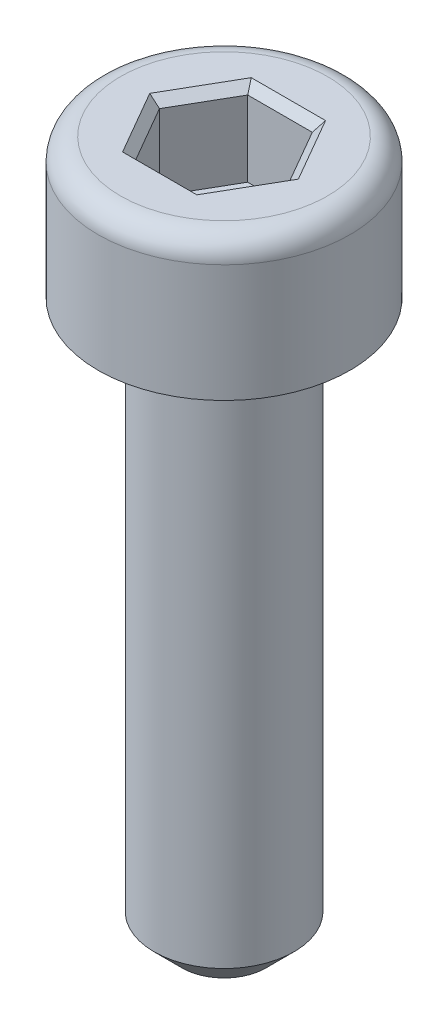
ISO-10303-21;
HEADER;
FILE_DESCRIPTION(('STEP AP214'),'2;1');
FILE_NAME('part.step','',(''),(''),'','','');
FILE_SCHEMA(('AUTOMOTIVE_DESIGN { 1 0 10303 214 1 1 1 1 }'));
ENDSEC;
DATA;
#1=APPLICATION_CONTEXT('core data for automotive mechanical design processes');
#2=APPLICATION_PROTOCOL_DEFINITION('international standard','automotive_design',2000,#1);
#3=PRODUCT_CONTEXT('',#1,'mechanical');
#4=PRODUCT('Part','Part','',(#3));
#5=PRODUCT_RELATED_PRODUCT_CATEGORY('part','',(#4));
#6=PRODUCT_DEFINITION_FORMATION('','',#4);
#7=PRODUCT_DEFINITION_CONTEXT('part definition',#1,'design');
#8=PRODUCT_DEFINITION('design','',#6,#7);
#9=PRODUCT_DEFINITION_SHAPE('','',#8);
#10=(LENGTH_UNIT() NAMED_UNIT(*) SI_UNIT(.MILLI.,.METRE.));
#11=(NAMED_UNIT(*) PLANE_ANGLE_UNIT() SI_UNIT($,.RADIAN.));
#12=(NAMED_UNIT(*) SI_UNIT($,.STERADIAN.) SOLID_ANGLE_UNIT());
#13=UNCERTAINTY_MEASURE_WITH_UNIT(LENGTH_MEASURE(1.E-05),#10,'distance_accuracy_value','');
#14=(GEOMETRIC_REPRESENTATION_CONTEXT(3) GLOBAL_UNCERTAINTY_ASSIGNED_CONTEXT((#13)) GLOBAL_UNIT_ASSIGNED_CONTEXT((#10,
#11,#12)) REPRESENTATION_CONTEXT('',''));
#15=CARTESIAN_POINT('',(0.,0.,0.));
#16=DIRECTION('',(0.,0.,1.));
#17=DIRECTION('',(1.,0.,0.));
#18=AXIS2_PLACEMENT_3D('',#15,#16,#17);
#19=CARTESIAN_POINT('',(0.,2.5,0.));
#20=DIRECTION('',(0.,-1.,0.));
#21=DIRECTION('',(0.,0.,-1.));
#22=AXIS2_PLACEMENT_3D('',#19,#20,#21);
#23=PLANE('',#22);
#24=DIRECTION('',(-0.5,0.,-0.866025403784439));
#25=VECTOR('',#24,1.);
#26=CARTESIAN_POINT('',(-0.995929214352107,2.5,0.575000000000003));
#27=LINE('',#26,#25);
#28=CARTESIAN_POINT('',(-0.663952809568066,2.5,1.15000000000001));
#29=VERTEX_POINT('',#28);
#30=CARTESIAN_POINT('',(-1.32790561913614,2.5,0.));
#31=VERTEX_POINT('',#30);
#32=EDGE_CURVE('E179',#29,#31,#27,.T.);
#33=ORIENTED_EDGE('',*,*,#32,.T.);
#34=DIRECTION('',(0.5,0.,-0.866025403784439));
#35=VECTOR('',#34,1.);
#36=CARTESIAN_POINT('',(-0.995929214352096,2.5,-0.574999999999997));
#37=LINE('',#36,#35);
#38=CARTESIAN_POINT('',(-0.663952809568066,2.5,-1.14999999999999));
#39=VERTEX_POINT('',#38);
#40=EDGE_CURVE('E181',#31,#39,#37,.T.);
#41=ORIENTED_EDGE('',*,*,#40,.T.);
#42=DIRECTION('',(1.,0.,0.));
#43=VECTOR('',#42,1.);
#44=CARTESIAN_POINT('',(0.,2.5,-1.14999999999999));
#45=LINE('',#44,#43);
#46=CARTESIAN_POINT('',(0.663952809568074,2.5,-1.14999999999999));
#47=VERTEX_POINT('',#46);
#48=EDGE_CURVE('E171',#39,#47,#45,.T.);
#49=ORIENTED_EDGE('',*,*,#48,.T.);
#50=DIRECTION('',(0.5,0.,0.866025403784439));
#51=VECTOR('',#50,1.);
#52=CARTESIAN_POINT('',(0.995929214352104,2.5,-0.574999999999999));
#53=LINE('',#52,#51);
#54=CARTESIAN_POINT('',(1.32790561913614,2.5,0.));
#55=VERTEX_POINT('',#54);
#56=EDGE_CURVE('E173',#47,#55,#53,.T.);
#57=ORIENTED_EDGE('',*,*,#56,.T.);
#58=DIRECTION('',(-0.5,0.,0.866025403784439));
#59=VECTOR('',#58,1.);
#60=CARTESIAN_POINT('',(0.995929214352114,2.5,0.575000000000004));
#61=LINE('',#60,#59);
#62=CARTESIAN_POINT('',(0.663952809568074,2.5,1.15000000000001));
#63=VERTEX_POINT('',#62);
#64=EDGE_CURVE('E175',#55,#63,#61,.T.);
#65=ORIENTED_EDGE('',*,*,#64,.T.);
#66=DIRECTION('',(-1.,0.,0.));
#67=VECTOR('',#66,1.);
#68=CARTESIAN_POINT('',(0.,2.5,1.15000000000001));
#69=LINE('',#68,#67);
#70=EDGE_CURVE('E177',#63,#29,#69,.T.);
#71=ORIENTED_EDGE('',*,*,#70,.T.);
#72=EDGE_LOOP('',(#33,#41,#49,#57,#65,#71));
#73=FACE_BOUND('',#72,.T.);
#74=CARTESIAN_POINT('',(0.,2.5,0.));
#75=DIRECTION('',(0.,1.,0.));
#76=DIRECTION('',(0.,0.,1.));
#77=AXIS2_PLACEMENT_3D('',#74,#75,#76);
#78=CIRCLE('',#77,1.85);
#79=CARTESIAN_POINT('',(0.,2.5,1.85));
#80=VERTEX_POINT('',#79);
#81=EDGE_CURVE('E167',#80,#80,#78,.T.);
#82=ORIENTED_EDGE('',*,*,#81,.T.);
#83=EDGE_LOOP('',(#82));
#84=FACE_BOUND('',#83,.T.);
#85=ADVANCED_FACE('F34',(#73,#84),#23,.F.);
#86=CARTESIAN_POINT('',(0.,2.1,0.));
#87=DIRECTION('',(0.,1.,0.));
#88=DIRECTION('',(0.,0.,1.));
#89=AXIS2_PLACEMENT_3D('',#86,#87,#88);
#90=TOROIDAL_SURFACE('',#89,1.85,0.4);
#91=ORIENTED_EDGE('',*,*,#81,.F.);
#92=EDGE_LOOP('',(#91));
#93=FACE_BOUND('',#92,.T.);
#94=CARTESIAN_POINT('',(0.,2.1,0.));
#95=DIRECTION('',(0.,1.,0.));
#96=DIRECTION('',(0.,0.,1.));
#97=AXIS2_PLACEMENT_3D('',#94,#95,#96);
#98=CIRCLE('',#97,2.25);
#99=CARTESIAN_POINT('',(0.,2.1,2.25));
#100=VERTEX_POINT('',#99);
#101=EDGE_CURVE('E164',#100,#100,#98,.T.);
#102=ORIENTED_EDGE('',*,*,#101,.T.);
#103=EDGE_LOOP('',(#102));
#104=FACE_BOUND('',#103,.T.);
#105=ADVANCED_FACE('F235',(#93,#104),#90,.T.);
#106=CARTESIAN_POINT('',(0.,6.97297297297297,0.));
#107=DIRECTION('',(0.,1.,0.));
#108=DIRECTION('',(0.,0.,1.));
#109=AXIS2_PLACEMENT_3D('',#106,#107,#108);
#110=CYLINDRICAL_SURFACE('',#109,2.25);
#111=ORIENTED_EDGE('',*,*,#101,.F.);
#112=EDGE_LOOP('',(#111));
#113=FACE_BOUND('',#112,.T.);
#114=CARTESIAN_POINT('',(0.,0.,0.));
#115=DIRECTION('',(0.,1.,0.));
#116=DIRECTION('',(0.,0.,1.));
#117=AXIS2_PLACEMENT_3D('',#114,#115,#116);
#118=CIRCLE('',#117,2.25);
#119=CARTESIAN_POINT('',(0.,0.,2.25));
#120=VERTEX_POINT('',#119);
#121=EDGE_CURVE('E161',#120,#120,#118,.T.);
#122=ORIENTED_EDGE('',*,*,#121,.T.);
#123=EDGE_LOOP('',(#122));
#124=FACE_BOUND('',#123,.T.);
#125=ADVANCED_FACE('F241',(#113,#124),#110,.T.);
#126=CARTESIAN_POINT('',(2.25,0.,0.));
#127=DIRECTION('',(0.,1.,0.));
#128=DIRECTION('',(0.,0.,1.));
#129=AXIS2_PLACEMENT_3D('',#126,#127,#128);
#130=PLANE('',#129);
#131=ORIENTED_EDGE('',*,*,#121,.F.);
#132=EDGE_LOOP('',(#131));
#133=FACE_BOUND('',#132,.T.);
#134=CARTESIAN_POINT('',(0.,0.,0.));
#135=DIRECTION('',(0.,1.,0.));
#136=DIRECTION('',(0.,0.,1.));
#137=AXIS2_PLACEMENT_3D('',#134,#135,#136);
#138=CIRCLE('',#137,1.25);
#139=CARTESIAN_POINT('',(0.,0.,1.25));
#140=VERTEX_POINT('',#139);
#141=EDGE_CURVE('E158',#140,#140,#138,.T.);
#142=ORIENTED_EDGE('',*,*,#141,.T.);
#143=EDGE_LOOP('',(#142));
#144=FACE_BOUND('',#143,.T.);
#145=ADVANCED_FACE('F371',(#133,#144),#130,.F.);
#146=CARTESIAN_POINT('',(0.,6.97297297297297,0.));
#147=DIRECTION('',(0.,1.,0.));
#148=DIRECTION('',(0.,0.,1.));
#149=AXIS2_PLACEMENT_3D('',#146,#147,#148);
#150=CYLINDRICAL_SURFACE('',#149,1.25);
#151=ORIENTED_EDGE('',*,*,#141,.F.);
#152=EDGE_LOOP('',(#151));
#153=FACE_BOUND('',#152,.T.);
#154=CARTESIAN_POINT('',(0.,-9.5,0.));
#155=DIRECTION('',(0.,1.,0.));
#156=DIRECTION('',(0.,0.,1.));
#157=AXIS2_PLACEMENT_3D('',#154,#155,#156);
#158=CIRCLE('',#157,1.25);
#159=CARTESIAN_POINT('',(0.,-9.5,1.25));
#160=VERTEX_POINT('',#159);
#161=EDGE_CURVE('E155',#160,#160,#158,.T.);
#162=ORIENTED_EDGE('',*,*,#161,.T.);
#163=EDGE_LOOP('',(#162));
#164=FACE_BOUND('',#163,.T.);
#165=ADVANCED_FACE('F362',(#153,#164),#150,.T.);
#166=CARTESIAN_POINT('',(0.,-10.,0.));
#167=DIRECTION('',(0.,1.,0.));
#168=DIRECTION('',(0.,0.,1.));
#169=AXIS2_PLACEMENT_3D('',#166,#167,#168);
#170=CONICAL_SURFACE('',#169,0.750000000000002,0.785398163397448);
#171=ORIENTED_EDGE('',*,*,#161,.F.);
#172=EDGE_LOOP('',(#171));
#173=FACE_BOUND('',#172,.T.);
#174=CARTESIAN_POINT('',(0.,-10.,0.));
#175=DIRECTION('',(0.,1.,0.));
#176=DIRECTION('',(0.,0.,1.));
#177=AXIS2_PLACEMENT_3D('',#174,#175,#176);
#178=CIRCLE('',#177,0.750000000000002);
#179=CARTESIAN_POINT('',(0.,-10.,0.750000000000002));
#180=VERTEX_POINT('',#179);
#181=EDGE_CURVE('E145',#180,#180,#178,.T.);
#182=ORIENTED_EDGE('',*,*,#181,.T.);
#183=EDGE_LOOP('',(#182));
#184=FACE_BOUND('',#183,.T.);
#185=ADVANCED_FACE('F357',(#173,#184),#170,.T.);
#186=CARTESIAN_POINT('',(0.750000000000002,-10.,0.));
#187=DIRECTION('',(0.,1.,0.));
#188=DIRECTION('',(0.,0.,1.));
#189=AXIS2_PLACEMENT_3D('',#186,#187,#188);
#190=PLANE('',#189);
#191=ORIENTED_EDGE('',*,*,#181,.F.);
#192=EDGE_LOOP('',(#191));
#193=FACE_BOUND('',#192,.T.);
#194=ADVANCED_FACE('F332',(#193),#190,.F.);
#195=CARTESIAN_POINT('',(-0.577350269189622,1.,-0.999999999999988));
#196=DIRECTION('',(-0.866025403784439,0.,-0.5));
#197=DIRECTION('',(-0.5,0.,0.866025403784439));
#198=AXIS2_PLACEMENT_3D('',#195,#196,#197);
#199=PLANE('',#198);
#200=DIRECTION('',(0.,1.,0.));
#201=VECTOR('',#200,1.);
#202=CARTESIAN_POINT('',(-0.577350269189622,1.,-0.999999999999988));
#203=LINE('',#202,#201);
#204=CARTESIAN_POINT('',(-0.577350269189622,1.,-0.999999999999988));
#205=VERTEX_POINT('',#204);
#206=CARTESIAN_POINT('',(-0.577350269189622,2.35,-0.999999999999988));
#207=VERTEX_POINT('',#206);
#208=EDGE_CURVE('E143',#205,#207,#203,.T.);
#209=ORIENTED_EDGE('',*,*,#208,.T.);
#210=DIRECTION('',(-0.5,0.,0.866025403784439));
#211=VECTOR('',#210,1.);
#212=CARTESIAN_POINT('',(-0.577350269189622,2.35,-0.999999999999988));
#213=LINE('',#212,#211);
#214=CARTESIAN_POINT('',(-1.15470053837925,2.35,0.));
#215=VERTEX_POINT('',#214);
#216=EDGE_CURVE('E115',#207,#215,#213,.T.);
#217=ORIENTED_EDGE('',*,*,#216,.T.);
#218=DIRECTION('',(0.,1.,0.));
#219=VECTOR('',#218,1.);
#220=CARTESIAN_POINT('',(-1.15470053837925,1.,0.));
#221=LINE('',#220,#219);
#222=CARTESIAN_POINT('',(-1.15470053837925,1.,0.));
#223=VERTEX_POINT('',#222);
#224=EDGE_CURVE('E107',#223,#215,#221,.T.);
#225=ORIENTED_EDGE('',*,*,#224,.F.);
#226=DIRECTION('',(-0.5,0.,0.866025403784438));
#227=VECTOR('',#226,1.);
#228=CARTESIAN_POINT('',(-0.577350269189622,1.,-0.999999999999988));
#229=LINE('',#228,#227);
#230=EDGE_CURVE('E112',#205,#223,#229,.T.);
#231=ORIENTED_EDGE('',*,*,#230,.F.);
#232=EDGE_LOOP('',(#209,#217,#225,#231));
#233=FACE_BOUND('',#232,.T.);
#234=ADVANCED_FACE('F110',(#233),#199,.F.);
#235=CARTESIAN_POINT('',(0.57735026918963,1.,-0.999999999999989));
#236=DIRECTION('',(0.,0.,-1.));
#237=DIRECTION('',(-1.,0.,0.));
#238=AXIS2_PLACEMENT_3D('',#235,#236,#237);
#239=PLANE('',#238);
#240=DIRECTION('',(0.,1.,0.));
#241=VECTOR('',#240,1.);
#242=CARTESIAN_POINT('',(0.57735026918963,1.,-0.999999999999989));
#243=LINE('',#242,#241);
#244=CARTESIAN_POINT('',(0.57735026918963,1.,-0.999999999999989));
#245=VERTEX_POINT('',#244);
#246=CARTESIAN_POINT('',(0.57735026918963,2.35,-0.999999999999989));
#247=VERTEX_POINT('',#246);
#248=EDGE_CURVE('E146',#245,#247,#243,.T.);
#249=ORIENTED_EDGE('',*,*,#248,.T.);
#250=DIRECTION('',(-1.,0.,0.));
#251=VECTOR('',#250,1.);
#252=CARTESIAN_POINT('',(0.57735026918963,2.35,-0.999999999999989));
#253=LINE('',#252,#251);
#254=EDGE_CURVE('E11',#247,#207,#253,.T.);
#255=ORIENTED_EDGE('',*,*,#254,.T.);
#256=ORIENTED_EDGE('',*,*,#208,.F.);
#257=DIRECTION('',(-1.,0.,0.));
#258=VECTOR('',#257,1.);
#259=CARTESIAN_POINT('',(0.57735026918963,1.,-0.999999999999989));
#260=LINE('',#259,#258);
#261=EDGE_CURVE('E118',#245,#205,#260,.T.);
#262=ORIENTED_EDGE('',*,*,#261,.F.);
#263=EDGE_LOOP('',(#249,#255,#256,#262));
#264=FACE_BOUND('',#263,.T.);
#265=ADVANCED_FACE('F219',(#264),#239,.F.);
#266=CARTESIAN_POINT('',(1.15470053837926,1.,0.));
#267=DIRECTION('',(0.866025403784439,0.,-0.5));
#268=DIRECTION('',(-0.5,0.,-0.866025403784439));
#269=AXIS2_PLACEMENT_3D('',#266,#267,#268);
#270=PLANE('',#269);
#271=DIRECTION('',(0.,1.,0.));
#272=VECTOR('',#271,1.);
#273=CARTESIAN_POINT('',(1.15470053837926,1.,0.));
#274=LINE('',#273,#272);
#275=CARTESIAN_POINT('',(1.15470053837926,1.,0.));
#276=VERTEX_POINT('',#275);
#277=CARTESIAN_POINT('',(1.15470053837926,2.35,0.));
#278=VERTEX_POINT('',#277);
#279=EDGE_CURVE('E148',#276,#278,#274,.T.);
#280=ORIENTED_EDGE('',*,*,#279,.T.);
#281=DIRECTION('',(-0.5,0.,-0.866025403784439));
#282=VECTOR('',#281,1.);
#283=CARTESIAN_POINT('',(1.15470053837926,2.35,0.));
#284=LINE('',#283,#282);
#285=EDGE_CURVE('E43',#278,#247,#284,.T.);
#286=ORIENTED_EDGE('',*,*,#285,.T.);
#287=ORIENTED_EDGE('',*,*,#248,.F.);
#288=DIRECTION('',(-0.5,0.,-0.866025403784438));
#289=VECTOR('',#288,1.);
#290=CARTESIAN_POINT('',(1.15470053837926,1.,0.));
#291=LINE('',#290,#289);
#292=EDGE_CURVE('E140',#276,#245,#291,.T.);
#293=ORIENTED_EDGE('',*,*,#292,.F.);
#294=EDGE_LOOP('',(#280,#286,#287,#293));
#295=FACE_BOUND('',#294,.T.);
#296=ADVANCED_FACE('F221',(#295),#270,.F.);
#297=CARTESIAN_POINT('',(0.57735026918963,1.,1.00000000000001));
#298=DIRECTION('',(0.866025403784439,0.,0.5));
#299=DIRECTION('',(0.5,0.,-0.866025403784439));
#300=AXIS2_PLACEMENT_3D('',#297,#298,#299);
#301=PLANE('',#300);
#302=DIRECTION('',(0.,1.,0.));
#303=VECTOR('',#302,1.);
#304=CARTESIAN_POINT('',(0.57735026918963,1.,1.00000000000001));
#305=LINE('',#304,#303);
#306=CARTESIAN_POINT('',(0.57735026918963,1.,1.00000000000001));
#307=VERTEX_POINT('',#306);
#308=CARTESIAN_POINT('',(0.57735026918963,2.35,1.00000000000001));
#309=VERTEX_POINT('',#308);
#310=EDGE_CURVE('E150',#307,#309,#305,.T.);
#311=ORIENTED_EDGE('',*,*,#310,.T.);
#312=DIRECTION('',(0.5,0.,-0.866025403784439));
#313=VECTOR('',#312,1.);
#314=CARTESIAN_POINT('',(0.57735026918963,2.35,1.00000000000001));
#315=LINE('',#314,#313);
#316=EDGE_CURVE('E58',#309,#278,#315,.T.);
#317=ORIENTED_EDGE('',*,*,#316,.T.);
#318=ORIENTED_EDGE('',*,*,#279,.F.);
#319=DIRECTION('',(0.5,0.,-0.866025403784439));
#320=VECTOR('',#319,1.);
#321=CARTESIAN_POINT('',(0.57735026918963,1.,1.00000000000001));
#322=LINE('',#321,#320);
#323=EDGE_CURVE('E137',#307,#276,#322,.T.);
#324=ORIENTED_EDGE('',*,*,#323,.F.);
#325=EDGE_LOOP('',(#311,#317,#318,#324));
#326=FACE_BOUND('',#325,.T.);
#327=ADVANCED_FACE('F223',(#326),#301,.F.);
#328=CARTESIAN_POINT('',(-0.577350269189622,1.,1.00000000000001));
#329=DIRECTION('',(0.,0.,1.));
#330=DIRECTION('',(1.,0.,0.));
#331=AXIS2_PLACEMENT_3D('',#328,#329,#330);
#332=PLANE('',#331);
#333=DIRECTION('',(0.,1.,0.));
#334=VECTOR('',#333,1.);
#335=CARTESIAN_POINT('',(-0.577350269189622,1.,1.00000000000001));
#336=LINE('',#335,#334);
#337=CARTESIAN_POINT('',(-0.577350269189622,1.,1.00000000000001));
#338=VERTEX_POINT('',#337);
#339=CARTESIAN_POINT('',(-0.577350269189622,2.35,1.00000000000001));
#340=VERTEX_POINT('',#339);
#341=EDGE_CURVE('E117',#338,#340,#336,.T.);
#342=ORIENTED_EDGE('',*,*,#341,.T.);
#343=DIRECTION('',(1.,0.,0.));
#344=VECTOR('',#343,1.);
#345=CARTESIAN_POINT('',(-0.577350269189622,2.35,1.00000000000001));
#346=LINE('',#345,#344);
#347=EDGE_CURVE('E186',#340,#309,#346,.T.);
#348=ORIENTED_EDGE('',*,*,#347,.T.);
#349=ORIENTED_EDGE('',*,*,#310,.F.);
#350=DIRECTION('',(1.,0.,0.));
#351=VECTOR('',#350,1.);
#352=CARTESIAN_POINT('',(-0.577350269189622,1.,1.00000000000001));
#353=LINE('',#352,#351);
#354=EDGE_CURVE('E127',#338,#307,#353,.T.);
#355=ORIENTED_EDGE('',*,*,#354,.F.);
#356=EDGE_LOOP('',(#342,#348,#349,#355));
#357=FACE_BOUND('',#356,.T.);
#358=ADVANCED_FACE('F225',(#357),#332,.F.);
#359=CARTESIAN_POINT('',(-1.15470053837925,1.,0.));
#360=DIRECTION('',(-0.866025403784439,0.,0.5));
#361=DIRECTION('',(0.5,0.,0.866025403784439));
#362=AXIS2_PLACEMENT_3D('',#359,#360,#361);
#363=PLANE('',#362);
#364=ORIENTED_EDGE('',*,*,#224,.T.);
#365=DIRECTION('',(0.5,0.,0.866025403784439));
#366=VECTOR('',#365,1.);
#367=CARTESIAN_POINT('',(-1.15470053837925,2.35,0.));
#368=LINE('',#367,#366);
#369=EDGE_CURVE('E184',#215,#340,#368,.T.);
#370=ORIENTED_EDGE('',*,*,#369,.T.);
#371=ORIENTED_EDGE('',*,*,#341,.F.);
#372=DIRECTION('',(0.5,0.,0.866025403784439));
#373=VECTOR('',#372,1.);
#374=CARTESIAN_POINT('',(-1.15470053837925,1.,0.));
#375=LINE('',#374,#373);
#376=EDGE_CURVE('E121',#223,#338,#375,.T.);
#377=ORIENTED_EDGE('',*,*,#376,.F.);
#378=EDGE_LOOP('',(#364,#370,#371,#377));
#379=FACE_BOUND('',#378,.T.);
#380=ADVANCED_FACE('F122',(#379),#363,.F.);
#381=CARTESIAN_POINT('',(0.,1.,0.));
#382=DIRECTION('',(0.,1.,0.));
#383=DIRECTION('',(0.,0.,1.));
#384=AXIS2_PLACEMENT_3D('',#381,#382,#383);
#385=PLANE('',#384);
#386=ORIENTED_EDGE('',*,*,#230,.T.);
#387=ORIENTED_EDGE('',*,*,#376,.T.);
#388=ORIENTED_EDGE('',*,*,#354,.T.);
#389=ORIENTED_EDGE('',*,*,#323,.T.);
#390=ORIENTED_EDGE('',*,*,#292,.T.);
#391=ORIENTED_EDGE('',*,*,#261,.T.);
#392=EDGE_LOOP('',(#386,#387,#388,#389,#390,#391));
#393=FACE_BOUND('',#392,.T.);
#394=ADVANCED_FACE('F129',(#393),#385,.T.);
#395=CARTESIAN_POINT('',(0.57735026918963,2.35,1.00000000000001));
#396=DIRECTION('',(0.612372435695791,-0.707106781186552,0.353553390593271));
#397=DIRECTION('',(0.5,0.,-0.866025403784439));
#398=AXIS2_PLACEMENT_3D('',#395,#396,#397);
#399=PLANE('',#398);
#400=DIRECTION('',(0.37796447300923,0.654653670707973,0.65465367070798));
#401=VECTOR('',#400,1.);
#402=CARTESIAN_POINT('',(0.412393049421163,2.06428571428572,0.714285714285723));
#403=LINE('',#402,#401);
#404=EDGE_CURVE('E134',#63,#309,#403,.F.);
#405=ORIENTED_EDGE('',*,*,#404,.F.);
#406=ORIENTED_EDGE('',*,*,#64,.F.);
#407=DIRECTION('',(0.755928946018459,0.654653670707972,0.));
#408=VECTOR('',#407,1.);
#409=CARTESIAN_POINT('',(0.824786098842322,2.06428571428572,0.));
#410=LINE('',#409,#408);
#411=EDGE_CURVE('E38',#278,#55,#410,.T.);
#412=ORIENTED_EDGE('',*,*,#411,.F.);
#413=ORIENTED_EDGE('',*,*,#316,.F.);
#414=EDGE_LOOP('',(#405,#406,#412,#413));
#415=FACE_BOUND('',#414,.T.);
#416=ADVANCED_FACE('F36',(#415),#399,.F.);
#417=CARTESIAN_POINT('',(1.15470053837926,2.35,0.));
#418=DIRECTION('',(0.61237243569579,-0.707106781186552,-0.353553390593272));
#419=DIRECTION('',(-0.5,0.,-0.866025403784439));
#420=AXIS2_PLACEMENT_3D('',#417,#418,#419);
#421=PLANE('',#420);
#422=ORIENTED_EDGE('',*,*,#411,.T.);
#423=ORIENTED_EDGE('',*,*,#56,.F.);
#424=DIRECTION('',(0.37796447300923,0.654653670707973,-0.65465367070798));
#425=VECTOR('',#424,1.);
#426=CARTESIAN_POINT('',(0.412393049421164,2.06428571428572,-0.714285714285701));
#427=LINE('',#426,#425);
#428=EDGE_CURVE('E197',#247,#47,#427,.T.);
#429=ORIENTED_EDGE('',*,*,#428,.F.);
#430=ORIENTED_EDGE('',*,*,#285,.F.);
#431=EDGE_LOOP('',(#422,#423,#429,#430));
#432=FACE_BOUND('',#431,.T.);
#433=ADVANCED_FACE('F212',(#432),#421,.F.);
#434=CARTESIAN_POINT('',(-0.577350269189622,2.35,1.00000000000001));
#435=DIRECTION('',(0.,-0.707106781186552,0.707106781186543));
#436=DIRECTION('',(1.,0.,0.));
#437=AXIS2_PLACEMENT_3D('',#434,#435,#436);
#438=PLANE('',#437);
#439=ORIENTED_EDGE('',*,*,#404,.T.);
#440=ORIENTED_EDGE('',*,*,#347,.F.);
#441=DIRECTION('',(-0.377964473009229,0.654653670707973,0.65465367070798));
#442=VECTOR('',#441,1.);
#443=CARTESIAN_POINT('',(-0.412393049421155,2.06428571428572,0.714285714285724));
#444=LINE('',#443,#442);
#445=EDGE_CURVE('E194',#29,#340,#444,.F.);
#446=ORIENTED_EDGE('',*,*,#445,.F.);
#447=ORIENTED_EDGE('',*,*,#70,.F.);
#448=EDGE_LOOP('',(#439,#440,#446,#447));
#449=FACE_BOUND('',#448,.T.);
#450=ADVANCED_FACE('F204',(#449),#438,.F.);
#451=CARTESIAN_POINT('',(0.57735026918963,2.35,-0.999999999999989));
#452=DIRECTION('',(0.,-0.707106781186552,-0.707106781186543));
#453=DIRECTION('',(-1.,0.,0.));
#454=AXIS2_PLACEMENT_3D('',#451,#452,#453);
#455=PLANE('',#454);
#456=ORIENTED_EDGE('',*,*,#428,.T.);
#457=ORIENTED_EDGE('',*,*,#48,.F.);
#458=DIRECTION('',(0.377964473009229,-0.654653670707973,0.654653670707981));
#459=VECTOR('',#458,1.);
#460=CARTESIAN_POINT('',(-0.577350269189622,2.35,-0.999999999999988));
#461=LINE('',#460,#459);
#462=EDGE_CURVE('E192',#207,#39,#461,.F.);
#463=ORIENTED_EDGE('',*,*,#462,.F.);
#464=ORIENTED_EDGE('',*,*,#254,.F.);
#465=EDGE_LOOP('',(#456,#457,#463,#464));
#466=FACE_BOUND('',#465,.T.);
#467=ADVANCED_FACE('F217',(#466),#455,.F.);
#468=CARTESIAN_POINT('',(-1.15470053837925,2.35,0.));
#469=DIRECTION('',(-0.612372435695791,-0.707106781186552,0.353553390593272));
#470=DIRECTION('',(0.5,0.,0.866025403784439));
#471=AXIS2_PLACEMENT_3D('',#468,#469,#470);
#472=PLANE('',#471);
#473=ORIENTED_EDGE('',*,*,#445,.T.);
#474=ORIENTED_EDGE('',*,*,#369,.F.);
#475=DIRECTION('',(-0.755928946018458,0.654653670707973,0.));
#476=VECTOR('',#475,1.);
#477=CARTESIAN_POINT('',(-0.824786098842315,2.06428571428572,0.));
#478=LINE('',#477,#476);
#479=EDGE_CURVE('E190',#31,#215,#478,.F.);
#480=ORIENTED_EDGE('',*,*,#479,.F.);
#481=ORIENTED_EDGE('',*,*,#32,.F.);
#482=EDGE_LOOP('',(#473,#474,#480,#481));
#483=FACE_BOUND('',#482,.T.);
#484=ADVANCED_FACE('F250',(#483),#472,.F.);
#485=CARTESIAN_POINT('',(-0.577350269189622,2.35,-0.999999999999988));
#486=DIRECTION('',(-0.612372435695791,-0.707106781186551,-0.353553390593272));
#487=DIRECTION('',(-0.5,0.,0.866025403784439));
#488=AXIS2_PLACEMENT_3D('',#485,#486,#487);
#489=PLANE('',#488);
#490=ORIENTED_EDGE('',*,*,#462,.T.);
#491=ORIENTED_EDGE('',*,*,#40,.F.);
#492=ORIENTED_EDGE('',*,*,#479,.T.);
#493=ORIENTED_EDGE('',*,*,#216,.F.);
#494=EDGE_LOOP('',(#490,#491,#492,#493));
#495=FACE_BOUND('',#494,.T.);
#496=ADVANCED_FACE('F247',(#495),#489,.F.);
#497=CLOSED_SHELL('',(#85,#105,#125,#145,#165,#185,#194,#234,#265,#296,#327,#358,#380,#394,#416,
#433,#450,#467,#484,#496));
#498=MANIFOLD_SOLID_BREP('B2',#497);
#499=ADVANCED_BREP_SHAPE_REPRESENTATION('',(#18,#498),#14);
#500=SHAPE_DEFINITION_REPRESENTATION(#9,#499);
ENDSEC;
END-ISO-10303-21;
